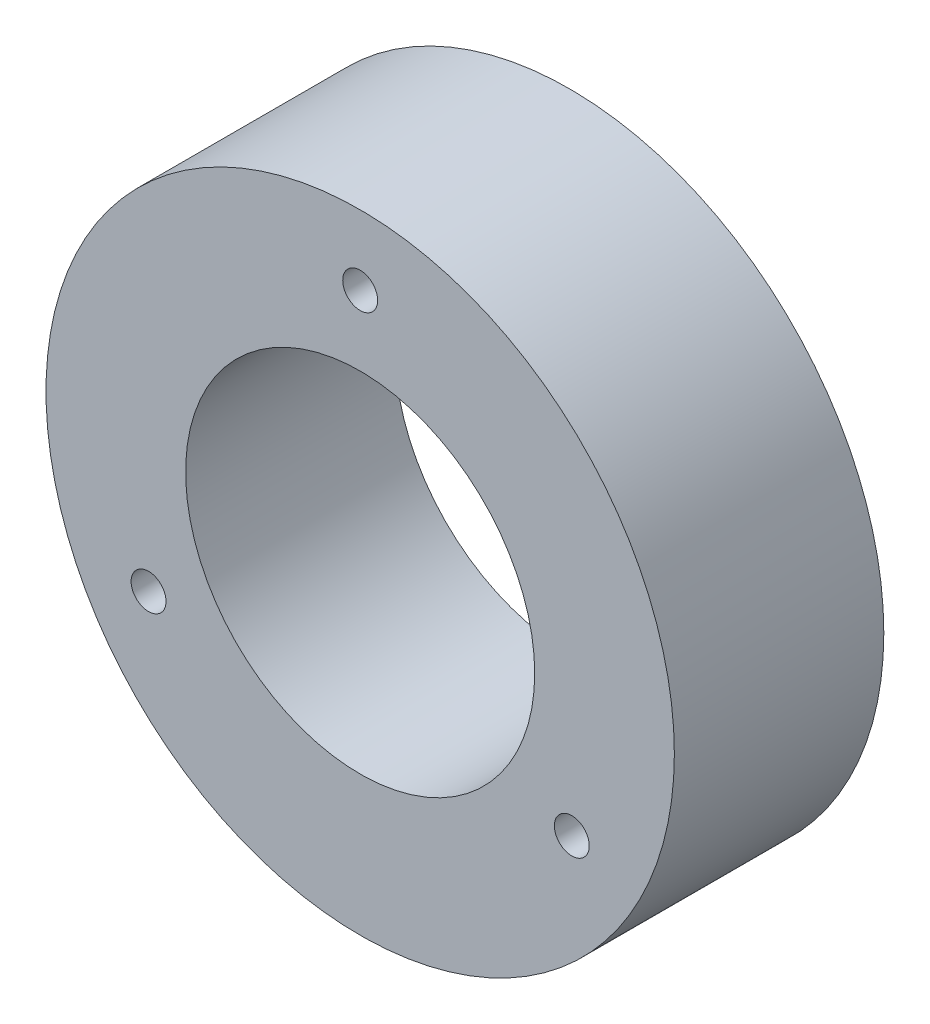
ISO-10303-21;
HEADER;
FILE_DESCRIPTION(('STEP AP214'),'2;1');
FILE_NAME('part.step','',(''),(''),'','','');
FILE_SCHEMA(('AUTOMOTIVE_DESIGN { 1 0 10303 214 1 1 1 1 }'));
ENDSEC;
DATA;
#1=APPLICATION_CONTEXT('core data for automotive mechanical design processes');
#2=APPLICATION_PROTOCOL_DEFINITION('international standard','automotive_design',2000,#1);
#3=PRODUCT_CONTEXT('',#1,'mechanical');
#4=PRODUCT('Part','Part','',(#3));
#5=PRODUCT_RELATED_PRODUCT_CATEGORY('part','',(#4));
#6=PRODUCT_DEFINITION_FORMATION('','',#4);
#7=PRODUCT_DEFINITION_CONTEXT('part definition',#1,'design');
#8=PRODUCT_DEFINITION('design','',#6,#7);
#9=PRODUCT_DEFINITION_SHAPE('','',#8);
#10=(LENGTH_UNIT() NAMED_UNIT(*) SI_UNIT(.MILLI.,.METRE.));
#11=(NAMED_UNIT(*) PLANE_ANGLE_UNIT() SI_UNIT($,.RADIAN.));
#12=(NAMED_UNIT(*) SI_UNIT($,.STERADIAN.) SOLID_ANGLE_UNIT());
#13=UNCERTAINTY_MEASURE_WITH_UNIT(LENGTH_MEASURE(1.E-05),#10,'distance_accuracy_value','');
#14=(GEOMETRIC_REPRESENTATION_CONTEXT(3) GLOBAL_UNCERTAINTY_ASSIGNED_CONTEXT((#13)) GLOBAL_UNIT_ASSIGNED_CONTEXT((#10,
#11,#12)) REPRESENTATION_CONTEXT('',''));
#15=CARTESIAN_POINT('',(0.,0.,0.));
#16=DIRECTION('',(0.,0.,1.));
#17=DIRECTION('',(1.,0.,0.));
#18=AXIS2_PLACEMENT_3D('',#15,#16,#17);
#19=CARTESIAN_POINT('',(0.,0.,26.5));
#20=DIRECTION('',(0.,0.,1.));
#21=DIRECTION('',(1.,0.,0.));
#22=AXIS2_PLACEMENT_3D('',#19,#20,#21);
#23=CYLINDRICAL_SURFACE('',#22,4.49999999999988);
#24=CARTESIAN_POINT('',(0.,0.,26.5));
#25=DIRECTION('',(0.,0.,1.));
#26=DIRECTION('',(1.,0.,0.));
#27=AXIS2_PLACEMENT_3D('',#24,#25,#26);
#28=CIRCLE('',#27,4.49999999999988);
#29=CARTESIAN_POINT('',(4.49999999999988,0.,26.5));
#30=VERTEX_POINT('',#29);
#31=EDGE_CURVE('E10',#30,#30,#28,.T.);
#32=ORIENTED_EDGE('',*,*,#31,.T.);
#33=EDGE_LOOP('',(#32));
#34=FACE_BOUND('',#33,.T.);
#35=CARTESIAN_POINT('',(0.,0.,29.5));
#36=DIRECTION('',(0.,0.,1.));
#37=DIRECTION('',(1.,0.,0.));
#38=AXIS2_PLACEMENT_3D('',#35,#36,#37);
#39=CIRCLE('',#38,4.49999999999988);
#40=CARTESIAN_POINT('',(4.49999999999988,0.,29.5));
#41=VERTEX_POINT('',#40);
#42=EDGE_CURVE('E42',#41,#41,#39,.T.);
#43=ORIENTED_EDGE('',*,*,#42,.F.);
#44=EDGE_LOOP('',(#43));
#45=FACE_BOUND('',#44,.T.);
#46=ADVANCED_FACE('F39',(#34,#45),#23,.T.);
#47=CARTESIAN_POINT('',(0.,0.,26.5));
#48=DIRECTION('',(0.,0.,1.));
#49=DIRECTION('',(1.,0.,0.));
#50=AXIS2_PLACEMENT_3D('',#47,#48,#49);
#51=PLANE('',#50);
#52=CARTESIAN_POINT('',(0.,3.49999999999988,26.5));
#53=DIRECTION('',(0.,0.,-1.));
#54=DIRECTION('',(-1.,0.,0.));
#55=AXIS2_PLACEMENT_3D('',#52,#53,#54);
#56=CIRCLE('',#55,0.25);
#57=CARTESIAN_POINT('',(-0.25,3.49999999999988,26.5));
#58=VERTEX_POINT('',#57);
#59=EDGE_CURVE('E69',#58,#58,#56,.T.);
#60=ORIENTED_EDGE('',*,*,#59,.F.);
#61=EDGE_LOOP('',(#60));
#62=FACE_BOUND('',#61,.T.);
#63=CARTESIAN_POINT('',(-3.03108891324558,-1.74999999999985,26.5));
#64=DIRECTION('',(0.,0.,-1.));
#65=DIRECTION('',(-1.,0.,0.));
#66=AXIS2_PLACEMENT_3D('',#63,#64,#65);
#67=CIRCLE('',#66,0.250000000000133);
#68=CARTESIAN_POINT('',(-3.28108891324571,-1.74999999999985,26.5));
#69=VERTEX_POINT('',#68);
#70=EDGE_CURVE('E66',#69,#69,#67,.T.);
#71=ORIENTED_EDGE('',*,*,#70,.F.);
#72=EDGE_LOOP('',(#71));
#73=FACE_BOUND('',#72,.T.);
#74=CARTESIAN_POINT('',(3.03108891324528,-1.75000000000002,26.5));
#75=DIRECTION('',(0.,0.,-1.));
#76=DIRECTION('',(-1.,0.,0.));
#77=AXIS2_PLACEMENT_3D('',#74,#75,#76);
#78=CIRCLE('',#77,0.250000000000197);
#79=CARTESIAN_POINT('',(2.78108891324509,-1.75000000000002,26.5));
#80=VERTEX_POINT('',#79);
#81=EDGE_CURVE('E60',#80,#80,#78,.T.);
#82=ORIENTED_EDGE('',*,*,#81,.F.);
#83=EDGE_LOOP('',(#82));
#84=FACE_BOUND('',#83,.T.);
#85=CARTESIAN_POINT('',(0.,0.,26.5));
#86=DIRECTION('',(0.,0.,1.));
#87=DIRECTION('',(1.,0.,0.));
#88=AXIS2_PLACEMENT_3D('',#85,#86,#87);
#89=CIRCLE('',#88,2.49999999999988);
#90=CARTESIAN_POINT('',(2.49999999999988,0.,26.5));
#91=VERTEX_POINT('',#90);
#92=EDGE_CURVE('E49',#91,#91,#89,.T.);
#93=ORIENTED_EDGE('',*,*,#92,.T.);
#94=EDGE_LOOP('',(#93));
#95=FACE_BOUND('',#94,.T.);
#96=ORIENTED_EDGE('',*,*,#31,.F.);
#97=EDGE_LOOP('',(#96));
#98=FACE_BOUND('',#97,.T.);
#99=ADVANCED_FACE('F85',(#62,#73,#84,#95,#98),#51,.F.);
#100=CARTESIAN_POINT('',(0.,0.,29.5));
#101=DIRECTION('',(0.,0.,1.));
#102=DIRECTION('',(1.,0.,0.));
#103=AXIS2_PLACEMENT_3D('',#100,#101,#102);
#104=PLANE('',#103);
#105=CARTESIAN_POINT('',(0.,3.49999999999988,29.5));
#106=DIRECTION('',(0.,0.,-1.));
#107=DIRECTION('',(-1.,0.,0.));
#108=AXIS2_PLACEMENT_3D('',#105,#106,#107);
#109=CIRCLE('',#108,0.25);
#110=CARTESIAN_POINT('',(-0.25,3.49999999999988,29.5));
#111=VERTEX_POINT('',#110);
#112=EDGE_CURVE('E54',#111,#111,#109,.T.);
#113=ORIENTED_EDGE('',*,*,#112,.T.);
#114=EDGE_LOOP('',(#113));
#115=FACE_BOUND('',#114,.T.);
#116=CARTESIAN_POINT('',(-3.03108891324558,-1.74999999999985,29.5));
#117=DIRECTION('',(0.,0.,-1.));
#118=DIRECTION('',(-1.,0.,0.));
#119=AXIS2_PLACEMENT_3D('',#116,#117,#118);
#120=CIRCLE('',#119,0.250000000000133);
#121=CARTESIAN_POINT('',(-3.28108891324571,-1.74999999999985,29.5));
#122=VERTEX_POINT('',#121);
#123=EDGE_CURVE('E63',#122,#122,#120,.T.);
#124=ORIENTED_EDGE('',*,*,#123,.T.);
#125=EDGE_LOOP('',(#124));
#126=FACE_BOUND('',#125,.T.);
#127=CARTESIAN_POINT('',(3.03108891324528,-1.75000000000002,29.5));
#128=DIRECTION('',(0.,0.,-1.));
#129=DIRECTION('',(-1.,0.,0.));
#130=AXIS2_PLACEMENT_3D('',#127,#128,#129);
#131=CIRCLE('',#130,0.250000000000197);
#132=CARTESIAN_POINT('',(2.78108891324509,-1.75000000000002,29.5));
#133=VERTEX_POINT('',#132);
#134=EDGE_CURVE('E57',#133,#133,#131,.T.);
#135=ORIENTED_EDGE('',*,*,#134,.T.);
#136=EDGE_LOOP('',(#135));
#137=FACE_BOUND('',#136,.T.);
#138=CARTESIAN_POINT('',(0.,0.,29.5));
#139=DIRECTION('',(0.,0.,1.));
#140=DIRECTION('',(1.,0.,0.));
#141=AXIS2_PLACEMENT_3D('',#138,#139,#140);
#142=CIRCLE('',#141,2.49999999999988);
#143=CARTESIAN_POINT('',(2.49999999999988,0.,29.5));
#144=VERTEX_POINT('',#143);
#145=EDGE_CURVE('E51',#144,#144,#142,.T.);
#146=ORIENTED_EDGE('',*,*,#145,.F.);
#147=EDGE_LOOP('',(#146));
#148=FACE_BOUND('',#147,.T.);
#149=ORIENTED_EDGE('',*,*,#42,.T.);
#150=EDGE_LOOP('',(#149));
#151=FACE_BOUND('',#150,.T.);
#152=ADVANCED_FACE('F75',(#115,#126,#137,#148,#151),#104,.T.);
#153=CARTESIAN_POINT('',(0.,0.,26.5));
#154=DIRECTION('',(0.,0.,1.));
#155=DIRECTION('',(1.,0.,0.));
#156=AXIS2_PLACEMENT_3D('',#153,#154,#155);
#157=CYLINDRICAL_SURFACE('',#156,2.49999999999988);
#158=ORIENTED_EDGE('',*,*,#92,.F.);
#159=EDGE_LOOP('',(#158));
#160=FACE_BOUND('',#159,.T.);
#161=ORIENTED_EDGE('',*,*,#145,.T.);
#162=EDGE_LOOP('',(#161));
#163=FACE_BOUND('',#162,.T.);
#164=ADVANCED_FACE('F96',(#160,#163),#157,.F.);
#165=CARTESIAN_POINT('',(3.03108891324528,-1.75000000000002,29.5));
#166=DIRECTION('',(0.,0.,-1.));
#167=DIRECTION('',(-1.,0.,0.));
#168=AXIS2_PLACEMENT_3D('',#165,#166,#167);
#169=CYLINDRICAL_SURFACE('',#168,0.250000000000197);
#170=ORIENTED_EDGE('',*,*,#134,.F.);
#171=EDGE_LOOP('',(#170));
#172=FACE_BOUND('',#171,.T.);
#173=ORIENTED_EDGE('',*,*,#81,.T.);
#174=EDGE_LOOP('',(#173));
#175=FACE_BOUND('',#174,.T.);
#176=ADVANCED_FACE('F99',(#172,#175),#169,.F.);
#177=CARTESIAN_POINT('',(-3.03108891324558,-1.74999999999985,29.5));
#178=DIRECTION('',(0.,0.,-1.));
#179=DIRECTION('',(-1.,0.,0.));
#180=AXIS2_PLACEMENT_3D('',#177,#178,#179);
#181=CYLINDRICAL_SURFACE('',#180,0.250000000000133);
#182=ORIENTED_EDGE('',*,*,#123,.F.);
#183=EDGE_LOOP('',(#182));
#184=FACE_BOUND('',#183,.T.);
#185=ORIENTED_EDGE('',*,*,#70,.T.);
#186=EDGE_LOOP('',(#185));
#187=FACE_BOUND('',#186,.T.);
#188=ADVANCED_FACE('F81',(#184,#187),#181,.F.);
#189=CARTESIAN_POINT('',(0.,3.49999999999988,29.5));
#190=DIRECTION('',(0.,0.,-1.));
#191=DIRECTION('',(-1.,0.,0.));
#192=AXIS2_PLACEMENT_3D('',#189,#190,#191);
#193=CYLINDRICAL_SURFACE('',#192,0.25);
#194=ORIENTED_EDGE('',*,*,#112,.F.);
#195=EDGE_LOOP('',(#194));
#196=FACE_BOUND('',#195,.T.);
#197=ORIENTED_EDGE('',*,*,#59,.T.);
#198=EDGE_LOOP('',(#197));
#199=FACE_BOUND('',#198,.T.);
#200=ADVANCED_FACE('F78',(#196,#199),#193,.F.);
#201=CLOSED_SHELL('',(#46,#99,#152,#164,#176,#188,#200));
#202=MANIFOLD_SOLID_BREP('B2',#201);
#203=ADVANCED_BREP_SHAPE_REPRESENTATION('',(#18,#202),#14);
#204=SHAPE_DEFINITION_REPRESENTATION(#9,#203);
ENDSEC;
END-ISO-10303-21;
